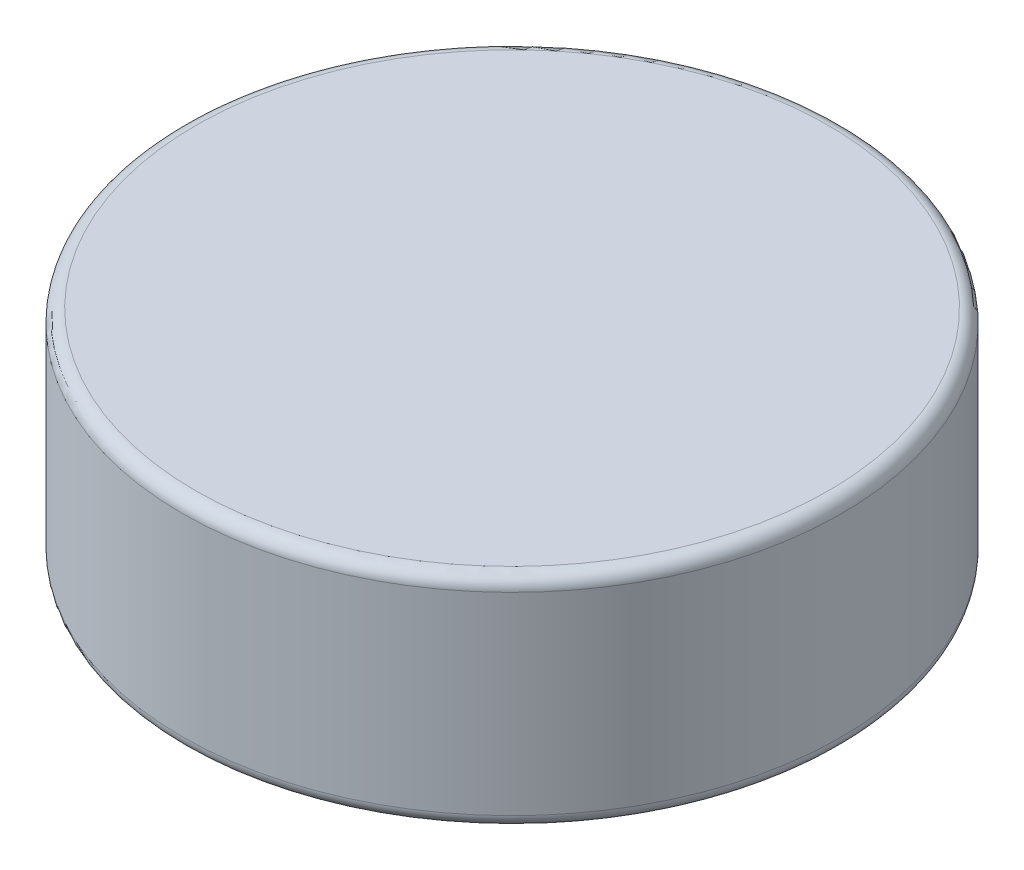
ISO-10303-21;
HEADER;
FILE_DESCRIPTION(('STEP AP214'),'2;1');
FILE_NAME('part.step','',(''),(''),'','','');
FILE_SCHEMA(('AUTOMOTIVE_DESIGN { 1 0 10303 214 1 1 1 1 }'));
ENDSEC;
DATA;
#1=APPLICATION_CONTEXT('core data for automotive mechanical design processes');
#2=APPLICATION_PROTOCOL_DEFINITION('international standard','automotive_design',2000,#1);
#3=PRODUCT_CONTEXT('',#1,'mechanical');
#4=PRODUCT('Part','Part','',(#3));
#5=PRODUCT_RELATED_PRODUCT_CATEGORY('part','',(#4));
#6=PRODUCT_DEFINITION_FORMATION('','',#4);
#7=PRODUCT_DEFINITION_CONTEXT('part definition',#1,'design');
#8=PRODUCT_DEFINITION('design','',#6,#7);
#9=PRODUCT_DEFINITION_SHAPE('','',#8);
#10=(LENGTH_UNIT() NAMED_UNIT(*) SI_UNIT(.MILLI.,.METRE.));
#11=(NAMED_UNIT(*) PLANE_ANGLE_UNIT() SI_UNIT($,.RADIAN.));
#12=(NAMED_UNIT(*) SI_UNIT($,.STERADIAN.) SOLID_ANGLE_UNIT());
#13=UNCERTAINTY_MEASURE_WITH_UNIT(LENGTH_MEASURE(1.E-05),#10,'distance_accuracy_value','');
#14=(GEOMETRIC_REPRESENTATION_CONTEXT(3) GLOBAL_UNCERTAINTY_ASSIGNED_CONTEXT((#13)) GLOBAL_UNIT_ASSIGNED_CONTEXT((#10,
#11,#12)) REPRESENTATION_CONTEXT('',''));
#15=CARTESIAN_POINT('',(0.,0.,0.));
#16=DIRECTION('',(0.,0.,1.));
#17=DIRECTION('',(1.,0.,0.));
#18=AXIS2_PLACEMENT_3D('',#15,#16,#17);
#19=CARTESIAN_POINT('',(0.,25.,0.));
#20=DIRECTION('',(0.,-1.,0.));
#21=DIRECTION('',(0.,0.,-1.));
#22=AXIS2_PLACEMENT_3D('',#19,#20,#21);
#23=CYLINDRICAL_SURFACE('',#22,75.);
#24=CARTESIAN_POINT('',(0.,-22.,0.));
#25=DIRECTION('',(0.,1.,0.));
#26=DIRECTION('',(0.,0.,1.));
#27=AXIS2_PLACEMENT_3D('',#24,#25,#26);
#28=CIRCLE('',#27,75.);
#29=CARTESIAN_POINT('',(0.,-22.,75.));
#30=VERTEX_POINT('',#29);
#31=EDGE_CURVE('E48',#30,#30,#28,.T.);
#32=ORIENTED_EDGE('',*,*,#31,.T.);
#33=EDGE_LOOP('',(#32));
#34=FACE_BOUND('',#33,.T.);
#35=CARTESIAN_POINT('',(0.,22.,0.));
#36=DIRECTION('',(0.,1.,0.));
#37=DIRECTION('',(0.,0.,1.));
#38=AXIS2_PLACEMENT_3D('',#35,#36,#37);
#39=CIRCLE('',#38,75.);
#40=CARTESIAN_POINT('',(0.,22.,75.));
#41=VERTEX_POINT('',#40);
#42=EDGE_CURVE('E52',#41,#41,#39,.F.);
#43=ORIENTED_EDGE('',*,*,#42,.T.);
#44=EDGE_LOOP('',(#43));
#45=FACE_BOUND('',#44,.T.);
#46=ADVANCED_FACE('F37',(#34,#45),#23,.T.);
#47=CARTESIAN_POINT('',(0.,25.,0.));
#48=DIRECTION('',(0.,1.,0.));
#49=DIRECTION('',(0.,0.,1.));
#50=AXIS2_PLACEMENT_3D('',#47,#48,#49);
#51=PLANE('',#50);
#52=CARTESIAN_POINT('',(0.,25.,0.));
#53=DIRECTION('',(0.,1.,0.));
#54=DIRECTION('',(0.,0.,1.));
#55=AXIS2_PLACEMENT_3D('',#52,#53,#54);
#56=CIRCLE('',#55,72.);
#57=CARTESIAN_POINT('',(0.,25.,72.));
#58=VERTEX_POINT('',#57);
#59=EDGE_CURVE('E10',#58,#58,#56,.T.);
#60=ORIENTED_EDGE('',*,*,#59,.T.);
#61=EDGE_LOOP('',(#60));
#62=FACE_BOUND('',#61,.T.);
#63=ADVANCED_FACE('F68',(#62),#51,.T.);
#64=CARTESIAN_POINT('',(0.,-25.,0.));
#65=DIRECTION('',(0.,1.,0.));
#66=DIRECTION('',(0.,0.,1.));
#67=AXIS2_PLACEMENT_3D('',#64,#65,#66);
#68=PLANE('',#67);
#69=CARTESIAN_POINT('',(0.,-25.,0.));
#70=DIRECTION('',(0.,1.,0.));
#71=DIRECTION('',(0.,0.,1.));
#72=AXIS2_PLACEMENT_3D('',#69,#70,#71);
#73=CIRCLE('',#72,72.);
#74=CARTESIAN_POINT('',(0.,-25.,72.));
#75=VERTEX_POINT('',#74);
#76=EDGE_CURVE('E44',#75,#75,#73,.F.);
#77=ORIENTED_EDGE('',*,*,#76,.T.);
#78=EDGE_LOOP('',(#77));
#79=FACE_BOUND('',#78,.T.);
#80=ADVANCED_FACE('F65',(#79),#68,.F.);
#81=CARTESIAN_POINT('',(0.,-22.,0.));
#82=DIRECTION('',(0.,1.,0.));
#83=DIRECTION('',(0.,0.,1.));
#84=AXIS2_PLACEMENT_3D('',#81,#82,#83);
#85=TOROIDAL_SURFACE('',#84,72.,3.);
#86=ORIENTED_EDGE('',*,*,#76,.F.);
#87=EDGE_LOOP('',(#86));
#88=FACE_BOUND('',#87,.T.);
#89=ORIENTED_EDGE('',*,*,#31,.F.);
#90=EDGE_LOOP('',(#89));
#91=FACE_BOUND('',#90,.T.);
#92=ADVANCED_FACE('F61',(#88,#91),#85,.T.);
#93=CARTESIAN_POINT('',(0.,22.,0.));
#94=DIRECTION('',(0.,1.,0.));
#95=DIRECTION('',(0.,0.,1.));
#96=AXIS2_PLACEMENT_3D('',#93,#94,#95);
#97=TOROIDAL_SURFACE('',#96,72.,3.);
#98=ORIENTED_EDGE('',*,*,#42,.F.);
#99=EDGE_LOOP('',(#98));
#100=FACE_BOUND('',#99,.T.);
#101=ORIENTED_EDGE('',*,*,#59,.F.);
#102=EDGE_LOOP('',(#101));
#103=FACE_BOUND('',#102,.T.);
#104=ADVANCED_FACE('F39',(#100,#103),#97,.T.);
#105=CLOSED_SHELL('',(#46,#63,#80,#92,#104));
#106=MANIFOLD_SOLID_BREP('B2',#105);
#107=ADVANCED_BREP_SHAPE_REPRESENTATION('',(#18,#106),#14);
#108=SHAPE_DEFINITION_REPRESENTATION(#9,#107);
ENDSEC;
END-ISO-10303-21;
